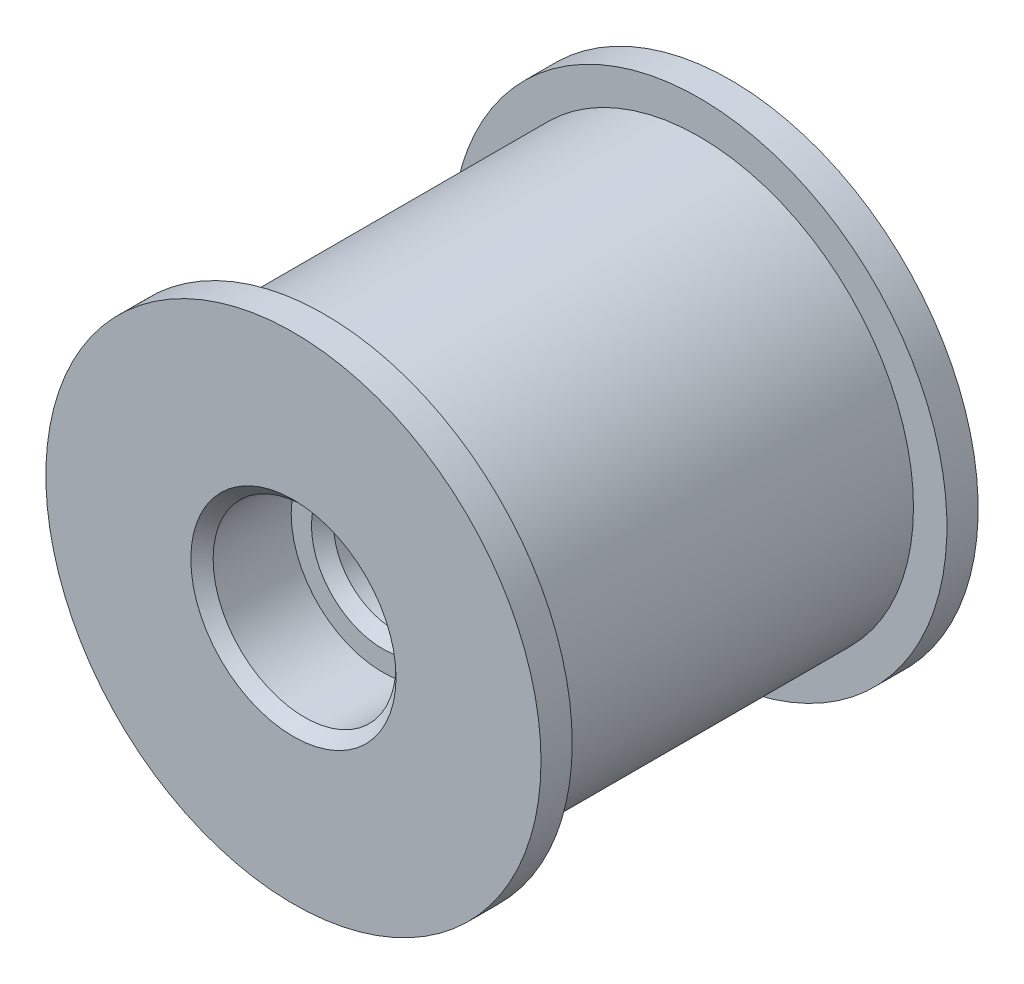
ISO-10303-21;
HEADER;
FILE_DESCRIPTION(('STEP AP214'),'2;1');
FILE_NAME('part.step','',(''),(''),'','','');
FILE_SCHEMA(('AUTOMOTIVE_DESIGN { 1 0 10303 214 1 1 1 1 }'));
ENDSEC;
DATA;
#1=APPLICATION_CONTEXT('core data for automotive mechanical design processes');
#2=APPLICATION_PROTOCOL_DEFINITION('international standard','automotive_design',2000,#1);
#3=PRODUCT_CONTEXT('',#1,'mechanical');
#4=PRODUCT('Part','Part','',(#3));
#5=PRODUCT_RELATED_PRODUCT_CATEGORY('part','',(#4));
#6=PRODUCT_DEFINITION_FORMATION('','',#4);
#7=PRODUCT_DEFINITION_CONTEXT('part definition',#1,'design');
#8=PRODUCT_DEFINITION('design','',#6,#7);
#9=PRODUCT_DEFINITION_SHAPE('','',#8);
#10=(LENGTH_UNIT() NAMED_UNIT(*) SI_UNIT(.MILLI.,.METRE.));
#11=(NAMED_UNIT(*) PLANE_ANGLE_UNIT() SI_UNIT($,.RADIAN.));
#12=(NAMED_UNIT(*) SI_UNIT($,.STERADIAN.) SOLID_ANGLE_UNIT());
#13=UNCERTAINTY_MEASURE_WITH_UNIT(LENGTH_MEASURE(1.E-05),#10,'distance_accuracy_value','');
#14=(GEOMETRIC_REPRESENTATION_CONTEXT(3) GLOBAL_UNCERTAINTY_ASSIGNED_CONTEXT((#13)) GLOBAL_UNIT_ASSIGNED_CONTEXT((#10,
#11,#12)) REPRESENTATION_CONTEXT('',''));
#15=CARTESIAN_POINT('',(0.,0.,0.));
#16=DIRECTION('',(0.,0.,1.));
#17=DIRECTION('',(1.,0.,0.));
#18=AXIS2_PLACEMENT_3D('',#15,#16,#17);
#19=CARTESIAN_POINT('',(0.,0.,-9.8));
#20=DIRECTION('',(0.,0.,1.));
#21=DIRECTION('',(1.,0.,0.));
#22=AXIS2_PLACEMENT_3D('',#19,#20,#21);
#23=CYLINDRICAL_SURFACE('',#22,9.6);
#24=CARTESIAN_POINT('',(0.,0.,8.4));
#25=DIRECTION('',(0.,0.,1.));
#26=DIRECTION('',(1.,0.,0.));
#27=AXIS2_PLACEMENT_3D('',#24,#25,#26);
#28=CIRCLE('',#27,9.6);
#29=CARTESIAN_POINT('',(9.6,0.,8.4));
#30=VERTEX_POINT('',#29);
#31=EDGE_CURVE('E57',#30,#30,#28,.F.);
#32=ORIENTED_EDGE('',*,*,#31,.T.);
#33=EDGE_LOOP('',(#32));
#34=FACE_BOUND('',#33,.T.);
#35=CARTESIAN_POINT('',(0.,0.,-8.4));
#36=DIRECTION('',(0.,0.,-1.));
#37=DIRECTION('',(-1.,0.,0.));
#38=AXIS2_PLACEMENT_3D('',#35,#36,#37);
#39=CIRCLE('',#38,9.6);
#40=CARTESIAN_POINT('',(-9.6,0.,-8.4));
#41=VERTEX_POINT('',#40);
#42=EDGE_CURVE('E58',#41,#41,#39,.F.);
#43=ORIENTED_EDGE('',*,*,#42,.T.);
#44=EDGE_LOOP('',(#43));
#45=FACE_BOUND('',#44,.T.);
#46=ADVANCED_FACE('F31',(#34,#45),#23,.T.);
#47=CARTESIAN_POINT('',(0.,0.,8.4));
#48=DIRECTION('',(0.,0.,1.));
#49=DIRECTION('',(1.,0.,0.));
#50=AXIS2_PLACEMENT_3D('',#47,#48,#49);
#51=CYLINDRICAL_SURFACE('',#50,11.1);
#52=CARTESIAN_POINT('',(0.,0.,8.4));
#53=DIRECTION('',(0.,0.,1.));
#54=DIRECTION('',(1.,0.,0.));
#55=AXIS2_PLACEMENT_3D('',#52,#53,#54);
#56=CIRCLE('',#55,11.1);
#57=CARTESIAN_POINT('',(11.1,0.,8.4));
#58=VERTEX_POINT('',#57);
#59=EDGE_CURVE('E65',#58,#58,#56,.T.);
#60=ORIENTED_EDGE('',*,*,#59,.T.);
#61=EDGE_LOOP('',(#60));
#62=FACE_BOUND('',#61,.T.);
#63=CARTESIAN_POINT('',(0.,0.,9.8));
#64=DIRECTION('',(0.,0.,1.));
#65=DIRECTION('',(1.,0.,0.));
#66=AXIS2_PLACEMENT_3D('',#63,#64,#65);
#67=CIRCLE('',#66,11.1);
#68=CARTESIAN_POINT('',(11.1,0.,9.8));
#69=VERTEX_POINT('',#68);
#70=EDGE_CURVE('E61',#69,#69,#67,.T.);
#71=ORIENTED_EDGE('',*,*,#70,.F.);
#72=EDGE_LOOP('',(#71));
#73=FACE_BOUND('',#72,.T.);
#74=ADVANCED_FACE('F105',(#62,#73),#51,.T.);
#75=CARTESIAN_POINT('',(0.,0.,8.4));
#76=DIRECTION('',(0.,0.,1.));
#77=DIRECTION('',(1.,0.,0.));
#78=AXIS2_PLACEMENT_3D('',#75,#76,#77);
#79=PLANE('',#78);
#80=ORIENTED_EDGE('',*,*,#31,.F.);
#81=EDGE_LOOP('',(#80));
#82=FACE_BOUND('',#81,.T.);
#83=ORIENTED_EDGE('',*,*,#59,.F.);
#84=EDGE_LOOP('',(#83));
#85=FACE_BOUND('',#84,.T.);
#86=ADVANCED_FACE('F111',(#82,#85),#79,.F.);
#87=CARTESIAN_POINT('',(0.,0.,9.8));
#88=DIRECTION('',(0.,0.,1.));
#89=DIRECTION('',(1.,0.,0.));
#90=AXIS2_PLACEMENT_3D('',#87,#88,#89);
#91=PLANE('',#90);
#92=CARTESIAN_POINT('',(0.,0.,9.8));
#93=DIRECTION('',(0.,0.,1.));
#94=DIRECTION('',(1.,0.,0.));
#95=AXIS2_PLACEMENT_3D('',#92,#93,#94);
#96=CIRCLE('',#95,4.6);
#97=CARTESIAN_POINT('',(4.6,0.,9.8));
#98=VERTEX_POINT('',#97);
#99=EDGE_CURVE('E54',#98,#98,#96,.F.);
#100=ORIENTED_EDGE('',*,*,#99,.T.);
#101=EDGE_LOOP('',(#100));
#102=FACE_BOUND('',#101,.T.);
#103=ORIENTED_EDGE('',*,*,#70,.T.);
#104=EDGE_LOOP('',(#103));
#105=FACE_BOUND('',#104,.T.);
#106=ADVANCED_FACE('F177',(#102,#105),#91,.T.);
#107=CARTESIAN_POINT('',(0.,0.,-8.4));
#108=DIRECTION('',(0.,0.,-1.));
#109=DIRECTION('',(-1.,0.,0.));
#110=AXIS2_PLACEMENT_3D('',#107,#108,#109);
#111=CYLINDRICAL_SURFACE('',#110,11.1);
#112=CARTESIAN_POINT('',(0.,0.,-8.4));
#113=DIRECTION('',(0.,0.,-1.));
#114=DIRECTION('',(-1.,0.,0.));
#115=AXIS2_PLACEMENT_3D('',#112,#113,#114);
#116=CIRCLE('',#115,11.1);
#117=CARTESIAN_POINT('',(-11.1,0.,-8.4));
#118=VERTEX_POINT('',#117);
#119=EDGE_CURVE('E62',#118,#118,#116,.T.);
#120=ORIENTED_EDGE('',*,*,#119,.T.);
#121=EDGE_LOOP('',(#120));
#122=FACE_BOUND('',#121,.T.);
#123=CARTESIAN_POINT('',(0.,0.,-9.8));
#124=DIRECTION('',(0.,0.,-1.));
#125=DIRECTION('',(-1.,0.,0.));
#126=AXIS2_PLACEMENT_3D('',#123,#124,#125);
#127=CIRCLE('',#126,11.1);
#128=CARTESIAN_POINT('',(-11.1,0.,-9.8));
#129=VERTEX_POINT('',#128);
#130=EDGE_CURVE('E70',#129,#129,#127,.T.);
#131=ORIENTED_EDGE('',*,*,#130,.F.);
#132=EDGE_LOOP('',(#131));
#133=FACE_BOUND('',#132,.T.);
#134=ADVANCED_FACE('F182',(#122,#133),#111,.T.);
#135=CARTESIAN_POINT('',(0.,0.,-8.4));
#136=DIRECTION('',(0.,0.,-1.));
#137=DIRECTION('',(-1.,0.,0.));
#138=AXIS2_PLACEMENT_3D('',#135,#136,#137);
#139=PLANE('',#138);
#140=ORIENTED_EDGE('',*,*,#42,.F.);
#141=EDGE_LOOP('',(#140));
#142=FACE_BOUND('',#141,.T.);
#143=ORIENTED_EDGE('',*,*,#119,.F.);
#144=EDGE_LOOP('',(#143));
#145=FACE_BOUND('',#144,.T.);
#146=ADVANCED_FACE('F213',(#142,#145),#139,.F.);
#147=CARTESIAN_POINT('',(0.,0.,-9.8));
#148=DIRECTION('',(0.,0.,1.));
#149=DIRECTION('',(1.,0.,0.));
#150=AXIS2_PLACEMENT_3D('',#147,#148,#149);
#151=PLANE('',#150);
#152=CARTESIAN_POINT('',(0.,0.,-9.8));
#153=DIRECTION('',(0.,0.,-1.));
#154=DIRECTION('',(-1.,0.,0.));
#155=AXIS2_PLACEMENT_3D('',#152,#153,#154);
#156=CIRCLE('',#155,8.);
#157=CARTESIAN_POINT('',(-8.,0.,-9.8));
#158=VERTEX_POINT('',#157);
#159=EDGE_CURVE('E73',#158,#158,#156,.T.);
#160=ORIENTED_EDGE('',*,*,#159,.F.);
#161=EDGE_LOOP('',(#160));
#162=FACE_BOUND('',#161,.T.);
#163=ORIENTED_EDGE('',*,*,#130,.T.);
#164=EDGE_LOOP('',(#163));
#165=FACE_BOUND('',#164,.T.);
#166=ADVANCED_FACE('F117',(#162,#165),#151,.F.);
#167=CARTESIAN_POINT('',(0.,0.,-9.8));
#168=DIRECTION('',(0.,0.,-1.));
#169=DIRECTION('',(-1.,0.,0.));
#170=AXIS2_PLACEMENT_3D('',#167,#168,#169);
#171=CYLINDRICAL_SURFACE('',#170,8.);
#172=CARTESIAN_POINT('',(0.,0.,-8.4));
#173=DIRECTION('',(0.,0.,-1.));
#174=DIRECTION('',(-1.,0.,0.));
#175=AXIS2_PLACEMENT_3D('',#172,#173,#174);
#176=CIRCLE('',#175,8.);
#177=CARTESIAN_POINT('',(-8.,0.,-8.4));
#178=VERTEX_POINT('',#177);
#179=EDGE_CURVE('E78',#178,#178,#176,.T.);
#180=ORIENTED_EDGE('',*,*,#179,.F.);
#181=EDGE_LOOP('',(#180));
#182=FACE_BOUND('',#181,.T.);
#183=ORIENTED_EDGE('',*,*,#159,.T.);
#184=EDGE_LOOP('',(#183));
#185=FACE_BOUND('',#184,.T.);
#186=ADVANCED_FACE('F194',(#182,#185),#171,.F.);
#187=CARTESIAN_POINT('',(0.,0.,-8.4));
#188=DIRECTION('',(0.,0.,-1.));
#189=DIRECTION('',(-1.,0.,0.));
#190=AXIS2_PLACEMENT_3D('',#187,#188,#189);
#191=CONICAL_SURFACE('',#190,8.,0.360836783033091);
#192=CARTESIAN_POINT('',(0.,0.,2.2));
#193=DIRECTION('',(0.,0.,-1.));
#194=DIRECTION('',(-1.,0.,0.));
#195=AXIS2_PLACEMENT_3D('',#192,#193,#194);
#196=CIRCLE('',#195,4.);
#197=CARTESIAN_POINT('',(-4.,0.,2.2));
#198=VERTEX_POINT('',#197);
#199=EDGE_CURVE('E81',#198,#198,#196,.T.);
#200=ORIENTED_EDGE('',*,*,#199,.F.);
#201=EDGE_LOOP('',(#200));
#202=FACE_BOUND('',#201,.T.);
#203=ORIENTED_EDGE('',*,*,#179,.T.);
#204=EDGE_LOOP('',(#203));
#205=FACE_BOUND('',#204,.T.);
#206=ADVANCED_FACE('F170',(#202,#205),#191,.F.);
#207=CARTESIAN_POINT('',(0.,4.,2.2));
#208=DIRECTION('',(0.,0.,1.));
#209=DIRECTION('',(1.,0.,0.));
#210=AXIS2_PLACEMENT_3D('',#207,#208,#209);
#211=PLANE('',#210);
#212=CARTESIAN_POINT('',(0.,0.,2.2));
#213=DIRECTION('',(0.,0.,1.));
#214=DIRECTION('',(1.,0.,0.));
#215=AXIS2_PLACEMENT_3D('',#212,#213,#214);
#216=CIRCLE('',#215,3.19102671376657);
#217=CARTESIAN_POINT('',(3.19102671376657,0.,2.2));
#218=VERTEX_POINT('',#217);
#219=EDGE_CURVE('E10',#218,#218,#216,.T.);
#220=ORIENTED_EDGE('',*,*,#219,.T.);
#221=EDGE_LOOP('',(#220));
#222=FACE_BOUND('',#221,.T.);
#223=ORIENTED_EDGE('',*,*,#199,.T.);
#224=EDGE_LOOP('',(#223));
#225=FACE_BOUND('',#224,.T.);
#226=ADVANCED_FACE('F102',(#222,#225),#211,.F.);
#227=CARTESIAN_POINT('',(0.,0.,-9.8));
#228=DIRECTION('',(0.,0.,-1.));
#229=DIRECTION('',(-1.,0.,0.));
#230=AXIS2_PLACEMENT_3D('',#227,#228,#229);
#231=CYLINDRICAL_SURFACE('',#230,2.69102671376656);
#232=CARTESIAN_POINT('',(0.,0.,5.3));
#233=DIRECTION('',(0.,0.,-1.));
#234=DIRECTION('',(-1.,0.,0.));
#235=AXIS2_PLACEMENT_3D('',#232,#233,#234);
#236=CIRCLE('',#235,2.69102671376656);
#237=CARTESIAN_POINT('',(-2.69102671376656,0.,5.3));
#238=VERTEX_POINT('',#237);
#239=EDGE_CURVE('E38',#238,#238,#236,.F.);
#240=ORIENTED_EDGE('',*,*,#239,.T.);
#241=EDGE_LOOP('',(#240));
#242=FACE_BOUND('',#241,.T.);
#243=CARTESIAN_POINT('',(0.,0.,2.70000000000001));
#244=DIRECTION('',(0.,0.,1.));
#245=DIRECTION('',(1.,0.,0.));
#246=AXIS2_PLACEMENT_3D('',#243,#244,#245);
#247=CIRCLE('',#246,2.69102671376656);
#248=CARTESIAN_POINT('',(2.69102671376656,0.,2.70000000000001));
#249=VERTEX_POINT('',#248);
#250=EDGE_CURVE('E42',#249,#249,#247,.F.);
#251=ORIENTED_EDGE('',*,*,#250,.T.);
#252=EDGE_LOOP('',(#251));
#253=FACE_BOUND('',#252,.T.);
#254=ADVANCED_FACE('F92',(#242,#253),#231,.F.);
#255=CARTESIAN_POINT('',(0.,2.69102671376656,5.8));
#256=DIRECTION('',(0.,0.,-1.));
#257=DIRECTION('',(-1.,0.,0.));
#258=AXIS2_PLACEMENT_3D('',#255,#256,#257);
#259=PLANE('',#258);
#260=CARTESIAN_POINT('',(0.,0.,5.8));
#261=DIRECTION('',(0.,0.,-1.));
#262=DIRECTION('',(-1.,0.,0.));
#263=AXIS2_PLACEMENT_3D('',#260,#261,#262);
#264=CIRCLE('',#263,3.19102671376657);
#265=CARTESIAN_POINT('',(-3.19102671376657,0.,5.8));
#266=VERTEX_POINT('',#265);
#267=EDGE_CURVE('E46',#266,#266,#264,.T.);
#268=ORIENTED_EDGE('',*,*,#267,.T.);
#269=EDGE_LOOP('',(#268));
#270=FACE_BOUND('',#269,.T.);
#271=CARTESIAN_POINT('',(0.,0.,5.8));
#272=DIRECTION('',(0.,0.,-1.));
#273=DIRECTION('',(-1.,0.,0.));
#274=AXIS2_PLACEMENT_3D('',#271,#272,#273);
#275=CIRCLE('',#274,4.1);
#276=CARTESIAN_POINT('',(-4.1,0.,5.8));
#277=VERTEX_POINT('',#276);
#278=EDGE_CURVE('E84',#277,#277,#275,.T.);
#279=ORIENTED_EDGE('',*,*,#278,.F.);
#280=EDGE_LOOP('',(#279));
#281=FACE_BOUND('',#280,.T.);
#282=ADVANCED_FACE('F90',(#270,#281),#259,.F.);
#283=CARTESIAN_POINT('',(0.,0.,-9.8));
#284=DIRECTION('',(0.,0.,-1.));
#285=DIRECTION('',(-1.,0.,0.));
#286=AXIS2_PLACEMENT_3D('',#283,#284,#285);
#287=CYLINDRICAL_SURFACE('',#286,4.1);
#288=CARTESIAN_POINT('',(0.,0.,9.3));
#289=DIRECTION('',(0.,0.,1.));
#290=DIRECTION('',(1.,0.,0.));
#291=AXIS2_PLACEMENT_3D('',#288,#289,#290);
#292=CIRCLE('',#291,4.1);
#293=CARTESIAN_POINT('',(4.1,0.,9.3));
#294=VERTEX_POINT('',#293);
#295=EDGE_CURVE('E51',#294,#294,#292,.T.);
#296=ORIENTED_EDGE('',*,*,#295,.T.);
#297=EDGE_LOOP('',(#296));
#298=FACE_BOUND('',#297,.T.);
#299=ORIENTED_EDGE('',*,*,#278,.T.);
#300=EDGE_LOOP('',(#299));
#301=FACE_BOUND('',#300,.T.);
#302=ADVANCED_FACE('F88',(#298,#301),#287,.F.);
#303=CARTESIAN_POINT('',(0.,0.,9.8));
#304=DIRECTION('',(0.,0.,1.));
#305=DIRECTION('',(1.,0.,0.));
#306=AXIS2_PLACEMENT_3D('',#303,#304,#305);
#307=CONICAL_SURFACE('',#306,4.6,0.785398163397445);
#308=ORIENTED_EDGE('',*,*,#295,.F.);
#309=EDGE_LOOP('',(#308));
#310=FACE_BOUND('',#309,.T.);
#311=ORIENTED_EDGE('',*,*,#99,.F.);
#312=EDGE_LOOP('',(#311));
#313=FACE_BOUND('',#312,.T.);
#314=ADVANCED_FACE('F99',(#310,#313),#307,.F.);
#315=CARTESIAN_POINT('',(0.,0.,5.8));
#316=DIRECTION('',(0.,0.,1.));
#317=DIRECTION('',(1.,0.,0.));
#318=AXIS2_PLACEMENT_3D('',#315,#316,#317);
#319=CONICAL_SURFACE('',#318,3.19102671376657,0.785398163397448);
#320=ORIENTED_EDGE('',*,*,#239,.F.);
#321=EDGE_LOOP('',(#320));
#322=FACE_BOUND('',#321,.T.);
#323=ORIENTED_EDGE('',*,*,#267,.F.);
#324=EDGE_LOOP('',(#323));
#325=FACE_BOUND('',#324,.T.);
#326=ADVANCED_FACE('F120',(#322,#325),#319,.F.);
#327=CARTESIAN_POINT('',(0.,0.,2.70000000000001));
#328=DIRECTION('',(0.,0.,-1.));
#329=DIRECTION('',(-1.,0.,0.));
#330=AXIS2_PLACEMENT_3D('',#327,#328,#329);
#331=CONICAL_SURFACE('',#330,2.69102671376656,0.78539816339745);
#332=ORIENTED_EDGE('',*,*,#219,.F.);
#333=EDGE_LOOP('',(#332));
#334=FACE_BOUND('',#333,.T.);
#335=ORIENTED_EDGE('',*,*,#250,.F.);
#336=EDGE_LOOP('',(#335));
#337=FACE_BOUND('',#336,.T.);
#338=ADVANCED_FACE('F33',(#334,#337),#331,.F.);
#339=CLOSED_SHELL('',(#46,#74,#86,#106,#134,#146,#166,#186,#206,#226,#254,#282,#302,#314,#326,#338));
#340=MANIFOLD_SOLID_BREP('B2',#339);
#341=ADVANCED_BREP_SHAPE_REPRESENTATION('',(#18,#340),#14);
#342=SHAPE_DEFINITION_REPRESENTATION(#9,#341);
ENDSEC;
END-ISO-10303-21;
